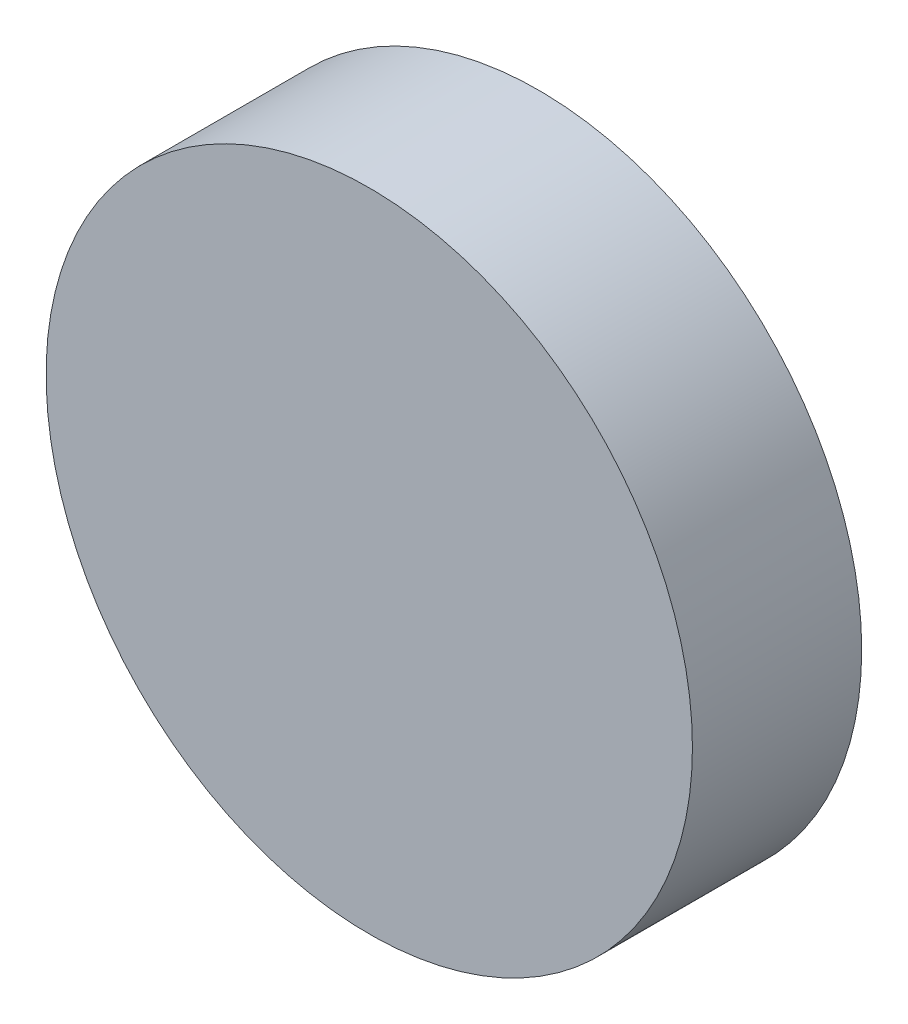
ISO-10303-21;
HEADER;
FILE_DESCRIPTION(('STEP AP214'),'2;1');
FILE_NAME('part.step','',(''),(''),'','','');
FILE_SCHEMA(('AUTOMOTIVE_DESIGN { 1 0 10303 214 1 1 1 1 }'));
ENDSEC;
DATA;
#1=APPLICATION_CONTEXT('core data for automotive mechanical design processes');
#2=APPLICATION_PROTOCOL_DEFINITION('international standard','automotive_design',2000,#1);
#3=PRODUCT_CONTEXT('',#1,'mechanical');
#4=PRODUCT('Part','Part','',(#3));
#5=PRODUCT_RELATED_PRODUCT_CATEGORY('part','',(#4));
#6=PRODUCT_DEFINITION_FORMATION('','',#4);
#7=PRODUCT_DEFINITION_CONTEXT('part definition',#1,'design');
#8=PRODUCT_DEFINITION('design','',#6,#7);
#9=PRODUCT_DEFINITION_SHAPE('','',#8);
#10=(LENGTH_UNIT() NAMED_UNIT(*) SI_UNIT(.MILLI.,.METRE.));
#11=(NAMED_UNIT(*) PLANE_ANGLE_UNIT() SI_UNIT($,.RADIAN.));
#12=(NAMED_UNIT(*) SI_UNIT($,.STERADIAN.) SOLID_ANGLE_UNIT());
#13=UNCERTAINTY_MEASURE_WITH_UNIT(LENGTH_MEASURE(1.E-05),#10,'distance_accuracy_value','');
#14=(GEOMETRIC_REPRESENTATION_CONTEXT(3) GLOBAL_UNCERTAINTY_ASSIGNED_CONTEXT((#13)) GLOBAL_UNIT_ASSIGNED_CONTEXT((#10,
#11,#12)) REPRESENTATION_CONTEXT('',''));
#15=CARTESIAN_POINT('',(0.,0.,0.));
#16=DIRECTION('',(0.,0.,1.));
#17=DIRECTION('',(1.,0.,0.));
#18=AXIS2_PLACEMENT_3D('',#15,#16,#17);
#19=CARTESIAN_POINT('',(0.,0.,110.));
#20=DIRECTION('',(0.,0.,-1.));
#21=DIRECTION('',(-1.,0.,0.));
#22=AXIS2_PLACEMENT_3D('',#19,#20,#21);
#23=CYLINDRICAL_SURFACE('',#22,210.);
#24=CARTESIAN_POINT('',(0.,0.,110.));
#25=DIRECTION('',(0.,0.,1.));
#26=DIRECTION('',(1.,0.,0.));
#27=AXIS2_PLACEMENT_3D('',#24,#25,#26);
#28=CIRCLE('',#27,210.);
#29=CARTESIAN_POINT('',(210.,0.,110.));
#30=VERTEX_POINT('',#29);
#31=EDGE_CURVE('E10',#30,#30,#28,.T.);
#32=ORIENTED_EDGE('',*,*,#31,.F.);
#33=EDGE_LOOP('',(#32));
#34=FACE_BOUND('',#33,.T.);
#35=CARTESIAN_POINT('',(0.,0.,0.));
#36=DIRECTION('',(0.,0.,1.));
#37=DIRECTION('',(1.,0.,0.));
#38=AXIS2_PLACEMENT_3D('',#35,#36,#37);
#39=CIRCLE('',#38,210.);
#40=CARTESIAN_POINT('',(210.,0.,0.));
#41=VERTEX_POINT('',#40);
#42=EDGE_CURVE('E44',#41,#41,#39,.T.);
#43=ORIENTED_EDGE('',*,*,#42,.T.);
#44=EDGE_LOOP('',(#43));
#45=FACE_BOUND('',#44,.T.);
#46=ADVANCED_FACE('F41',(#34,#45),#23,.T.);
#47=CARTESIAN_POINT('',(0.,0.,110.));
#48=DIRECTION('',(0.,0.,1.));
#49=DIRECTION('',(1.,0.,0.));
#50=AXIS2_PLACEMENT_3D('',#47,#48,#49);
#51=PLANE('',#50);
#52=ORIENTED_EDGE('',*,*,#31,.T.);
#53=EDGE_LOOP('',(#52));
#54=FACE_BOUND('',#53,.T.);
#55=ADVANCED_FACE('F56',(#54),#51,.T.);
#56=CARTESIAN_POINT('',(0.,0.,0.));
#57=DIRECTION('',(0.,0.,1.));
#58=DIRECTION('',(1.,0.,0.));
#59=AXIS2_PLACEMENT_3D('',#56,#57,#58);
#60=PLANE('',#59);
#61=ORIENTED_EDGE('',*,*,#42,.F.);
#62=EDGE_LOOP('',(#61));
#63=FACE_BOUND('',#62,.T.);
#64=ADVANCED_FACE('F54',(#63),#60,.F.);
#65=CLOSED_SHELL('',(#46,#55,#64));
#66=MANIFOLD_SOLID_BREP('B2',#65);
#67=ADVANCED_BREP_SHAPE_REPRESENTATION('',(#18,#66),#14);
#68=SHAPE_DEFINITION_REPRESENTATION(#9,#67);
ENDSEC;
END-ISO-10303-21;
